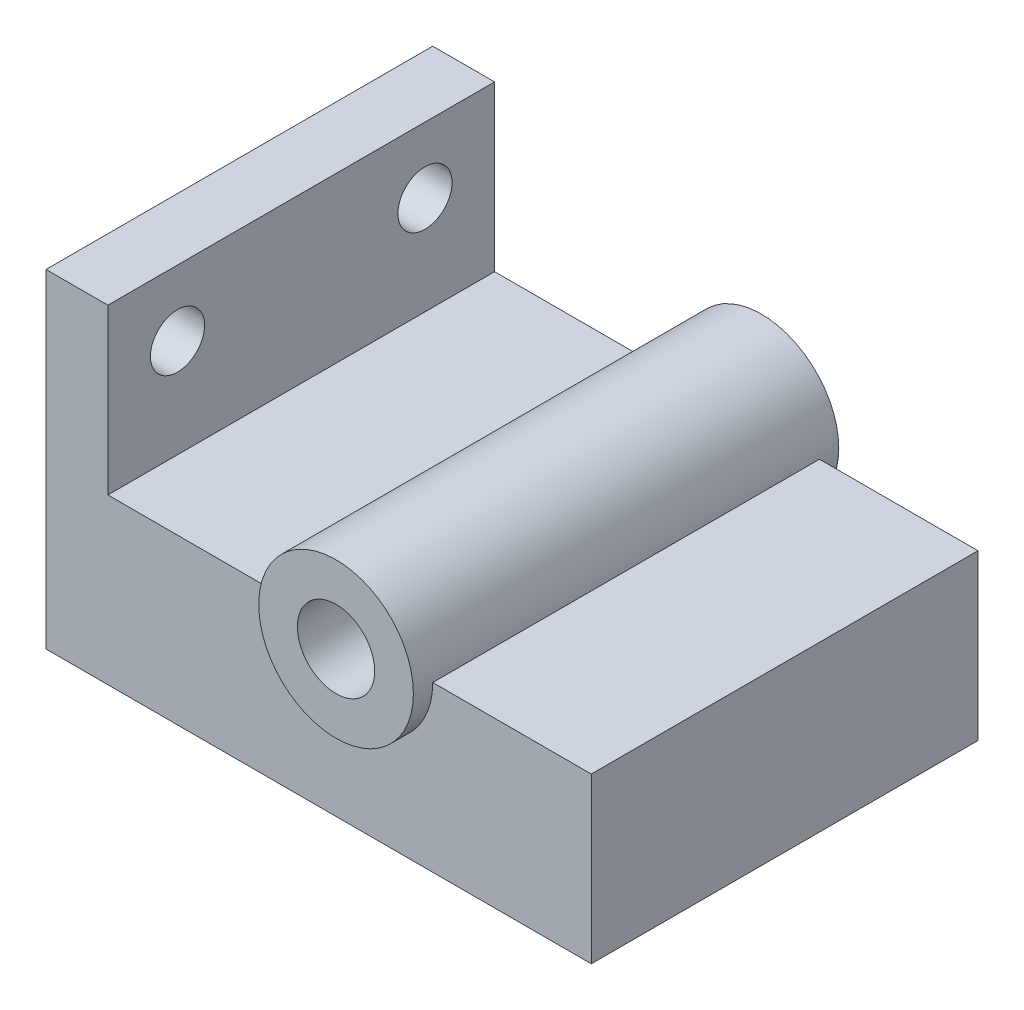
ISO-10303-21;
HEADER;
FILE_DESCRIPTION(('STEP AP214'),'2;1');
FILE_NAME('part.step','',(''),(''),'','','');
FILE_SCHEMA(('AUTOMOTIVE_DESIGN { 1 0 10303 214 1 1 1 1 }'));
ENDSEC;
DATA;
#1=APPLICATION_CONTEXT('core data for automotive mechanical design processes');
#2=APPLICATION_PROTOCOL_DEFINITION('international standard','automotive_design',2000,#1);
#3=PRODUCT_CONTEXT('',#1,'mechanical');
#4=PRODUCT('Part','Part','',(#3));
#5=PRODUCT_RELATED_PRODUCT_CATEGORY('part','',(#4));
#6=PRODUCT_DEFINITION_FORMATION('','',#4);
#7=PRODUCT_DEFINITION_CONTEXT('part definition',#1,'design');
#8=PRODUCT_DEFINITION('design','',#6,#7);
#9=PRODUCT_DEFINITION_SHAPE('','',#8);
#10=(LENGTH_UNIT() NAMED_UNIT(*) SI_UNIT(.MILLI.,.METRE.));
#11=(NAMED_UNIT(*) PLANE_ANGLE_UNIT() SI_UNIT($,.RADIAN.));
#12=(NAMED_UNIT(*) SI_UNIT($,.STERADIAN.) SOLID_ANGLE_UNIT());
#13=UNCERTAINTY_MEASURE_WITH_UNIT(LENGTH_MEASURE(1.E-05),#10,'distance_accuracy_value','');
#14=(GEOMETRIC_REPRESENTATION_CONTEXT(3) GLOBAL_UNCERTAINTY_ASSIGNED_CONTEXT((#13)) GLOBAL_UNIT_ASSIGNED_CONTEXT((#10,
#11,#12)) REPRESENTATION_CONTEXT('',''));
#15=CARTESIAN_POINT('',(0.,0.,0.));
#16=DIRECTION('',(0.,0.,1.));
#17=DIRECTION('',(1.,0.,0.));
#18=AXIS2_PLACEMENT_3D('',#15,#16,#17);
#19=CARTESIAN_POINT('',(1623.00318177857,830.782645564034,-50.0000270000001));
#20=DIRECTION('',(0.,1.,0.));
#21=DIRECTION('',(-1.,0.,0.));
#22=AXIS2_PLACEMENT_3D('',#19,#20,#21);
#23=PLANE('',#22);
#24=DIRECTION('',(0.,0.,1.));
#25=VECTOR('',#24,1.);
#26=CARTESIAN_POINT('',(1723.00323577857,830.782645564034,-50.0000270000001));
#27=LINE('',#26,#25);
#28=CARTESIAN_POINT('',(1723.00323577857,830.782645564034,-50.0000270000001));
#29=VERTEX_POINT('',#28);
#30=CARTESIAN_POINT('',(1723.00323577857,830.782645564034,50.0000269999999));
#31=VERTEX_POINT('',#30);
#32=EDGE_CURVE('E11',#29,#31,#27,.T.);
#33=ORIENTED_EDGE('',*,*,#32,.T.);
#34=DIRECTION('',(-1.,0.,0.));
#35=VECTOR('',#34,1.);
#36=CARTESIAN_POINT('',(1623.00318177857,830.782645564034,50.0000269999999));
#37=LINE('',#36,#35);
#38=CARTESIAN_POINT('',(1764.00325791857,830.782645564034,50.0000269999999));
#39=VERTEX_POINT('',#38);
#40=EDGE_CURVE('E201',#39,#31,#37,.T.);
#41=ORIENTED_EDGE('',*,*,#40,.F.);
#42=DIRECTION('',(0.,0.,1.));
#43=VECTOR('',#42,1.);
#44=CARTESIAN_POINT('',(1764.00325791857,830.782645564034,-50.0000270000001));
#45=LINE('',#44,#43);
#46=CARTESIAN_POINT('',(1764.00325791857,830.782645564034,-50.0000270000001));
#47=VERTEX_POINT('',#46);
#48=EDGE_CURVE('E45',#47,#39,#45,.T.);
#49=ORIENTED_EDGE('',*,*,#48,.F.);
#50=DIRECTION('',(-1.,0.,0.));
#51=VECTOR('',#50,1.);
#52=CARTESIAN_POINT('',(1623.00318177857,830.782645564034,-50.0000270000001));
#53=LINE('',#52,#51);
#54=EDGE_CURVE('E222',#47,#29,#53,.T.);
#55=ORIENTED_EDGE('',*,*,#54,.T.);
#56=EDGE_LOOP('',(#33,#41,#49,#55));
#57=FACE_BOUND('',#56,.T.);
#58=ADVANCED_FACE('F36',(#57),#23,.T.);
#59=CARTESIAN_POINT('',(1764.00325791857,788.282622614034,-50.0000270000001));
#60=DIRECTION('',(1.,0.,0.));
#61=DIRECTION('',(0.,0.,-1.));
#62=AXIS2_PLACEMENT_3D('',#59,#60,#61);
#63=PLANE('',#62);
#64=ORIENTED_EDGE('',*,*,#48,.T.);
#65=DIRECTION('',(0.,1.,0.));
#66=VECTOR('',#65,1.);
#67=CARTESIAN_POINT('',(1764.00325791857,788.282622614034,50.0000269999999));
#68=LINE('',#67,#66);
#69=CARTESIAN_POINT('',(1764.00325791857,788.282622614034,50.0000269999999));
#70=VERTEX_POINT('',#69);
#71=EDGE_CURVE('E198',#70,#39,#68,.T.);
#72=ORIENTED_EDGE('',*,*,#71,.F.);
#73=DIRECTION('',(0.,0.,1.));
#74=VECTOR('',#73,1.);
#75=CARTESIAN_POINT('',(1764.00325791857,788.282622614034,-50.0000270000001));
#76=LINE('',#75,#74);
#77=CARTESIAN_POINT('',(1764.00325791857,788.282622614034,-50.0000270000001));
#78=VERTEX_POINT('',#77);
#79=EDGE_CURVE('E226',#78,#70,#76,.T.);
#80=ORIENTED_EDGE('',*,*,#79,.F.);
#81=DIRECTION('',(0.,1.,0.));
#82=VECTOR('',#81,1.);
#83=CARTESIAN_POINT('',(1764.00325791857,788.282622614034,-50.0000270000001));
#84=LINE('',#83,#82);
#85=EDGE_CURVE('E219',#78,#47,#84,.T.);
#86=ORIENTED_EDGE('',*,*,#85,.T.);
#87=EDGE_LOOP('',(#64,#72,#80,#86));
#88=FACE_BOUND('',#87,.T.);
#89=ADVANCED_FACE('F267',(#88),#63,.T.);
#90=CARTESIAN_POINT('',(1623.00318177857,788.282622614034,-50.0000270000001));
#91=DIRECTION('',(0.,-1.,0.));
#92=DIRECTION('',(0.,0.,-1.));
#93=AXIS2_PLACEMENT_3D('',#90,#91,#92);
#94=PLANE('',#93);
#95=DIRECTION('',(-1.,0.,0.));
#96=VECTOR('',#95,1.);
#97=CARTESIAN_POINT('',(1748.00324927857,788.282622614034,-30.0000162000001));
#98=LINE('',#97,#96);
#99=CARTESIAN_POINT('',(1748.00324927857,788.282622614034,-30.0000162000001));
#100=VERTEX_POINT('',#99);
#101=CARTESIAN_POINT('',(1623.00318177857,788.282622614034,-30.0000162000001));
#102=VERTEX_POINT('',#101);
#103=EDGE_CURVE('E130',#100,#102,#98,.T.);
#104=ORIENTED_EDGE('',*,*,#103,.T.);
#105=DIRECTION('',(0.,0.,1.));
#106=VECTOR('',#105,1.);
#107=CARTESIAN_POINT('',(1623.00318177857,788.282622614034,-50.0000270000001));
#108=LINE('',#107,#106);
#109=CARTESIAN_POINT('',(1623.00318177857,788.282622614034,-50.0000270000001));
#110=VERTEX_POINT('',#109);
#111=EDGE_CURVE('E228',#110,#102,#108,.T.);
#112=ORIENTED_EDGE('',*,*,#111,.F.);
#113=DIRECTION('',(1.,0.,0.));
#114=VECTOR('',#113,1.);
#115=CARTESIAN_POINT('',(1623.00318177857,788.282622614034,-50.0000270000001));
#116=LINE('',#115,#114);
#117=EDGE_CURVE('E216',#110,#78,#116,.T.);
#118=ORIENTED_EDGE('',*,*,#117,.T.);
#119=ORIENTED_EDGE('',*,*,#79,.T.);
#120=DIRECTION('',(1.,0.,0.));
#121=VECTOR('',#120,1.);
#122=CARTESIAN_POINT('',(1623.00318177857,788.282622614034,50.0000269999999));
#123=LINE('',#122,#121);
#124=CARTESIAN_POINT('',(1623.00318177857,788.282622614034,50.0000269999999));
#125=VERTEX_POINT('',#124);
#126=EDGE_CURVE('E195',#125,#70,#123,.T.);
#127=ORIENTED_EDGE('',*,*,#126,.F.);
#128=CARTESIAN_POINT('',(1623.00318177857,788.282622614034,30.0000161999998));
#129=VERTEX_POINT('',#128);
#130=EDGE_CURVE('E230',#129,#125,#108,.T.);
#131=ORIENTED_EDGE('',*,*,#130,.F.);
#132=DIRECTION('',(-1.,0.,0.));
#133=VECTOR('',#132,1.);
#134=CARTESIAN_POINT('',(1748.00324927857,788.282622614034,30.0000161999999));
#135=LINE('',#134,#133);
#136=CARTESIAN_POINT('',(1748.00324927857,788.282622614034,30.0000161999999));
#137=VERTEX_POINT('',#136);
#138=EDGE_CURVE('E53',#137,#129,#135,.T.);
#139=ORIENTED_EDGE('',*,*,#138,.F.);
#140=DIRECTION('',(0.,0.,1.));
#141=VECTOR('',#140,1.);
#142=CARTESIAN_POINT('',(1748.00324927857,788.282622614034,-30.0000162000001));
#143=LINE('',#142,#141);
#144=EDGE_CURVE('E146',#100,#137,#143,.T.);
#145=ORIENTED_EDGE('',*,*,#144,.F.);
#146=EDGE_LOOP('',(#104,#112,#118,#119,#127,#131,#139,#145));
#147=FACE_BOUND('',#146,.T.);
#148=ADVANCED_FACE('F150',(#147),#94,.T.);
#149=CARTESIAN_POINT('',(1623.00318177857,788.282622614034,-50.0000270000001));
#150=DIRECTION('',(-1.,0.,0.));
#151=DIRECTION('',(0.,-1.,0.));
#152=AXIS2_PLACEMENT_3D('',#149,#150,#151);
#153=PLANE('',#152);
#154=CARTESIAN_POINT('',(1623.00318177857,856.282659334034,-32.0000172800001));
#155=DIRECTION('',(-1.,0.,0.));
#156=DIRECTION('',(0.,-1.,0.));
#157=AXIS2_PLACEMENT_3D('',#154,#155,#156);
#158=CIRCLE('',#157,7.00000378);
#159=CARTESIAN_POINT('',(1623.00318177857,849.282655554034,-32.0000172800001));
#160=VERTEX_POINT('',#159);
#161=EDGE_CURVE('E240',#160,#160,#158,.T.);
#162=ORIENTED_EDGE('',*,*,#161,.F.);
#163=EDGE_LOOP('',(#162));
#164=FACE_BOUND('',#163,.T.);
#165=CARTESIAN_POINT('',(1623.00318177857,856.282659334034,32.0000172799999));
#166=DIRECTION('',(-1.,0.,0.));
#167=DIRECTION('',(0.,-1.,0.));
#168=AXIS2_PLACEMENT_3D('',#165,#166,#167);
#169=CIRCLE('',#168,7.00000378);
#170=CARTESIAN_POINT('',(1623.00318177857,849.282655554034,32.0000172799999));
#171=VERTEX_POINT('',#170);
#172=EDGE_CURVE('E245',#171,#171,#169,.T.);
#173=ORIENTED_EDGE('',*,*,#172,.F.);
#174=EDGE_LOOP('',(#173));
#175=FACE_BOUND('',#174,.T.);
#176=DIRECTION('',(0.,-1.,0.));
#177=VECTOR('',#176,1.);
#178=CARTESIAN_POINT('',(1623.00318177857,813.282636114033,-30.0000162000001));
#179=LINE('',#178,#177);
#180=CARTESIAN_POINT('',(1623.00318177857,813.282636114033,-30.0000162000001));
#181=VERTEX_POINT('',#180);
#182=EDGE_CURVE('E136',#181,#102,#179,.T.);
#183=ORIENTED_EDGE('',*,*,#182,.F.);
#184=DIRECTION('',(0.,0.,-1.));
#185=VECTOR('',#184,1.);
#186=CARTESIAN_POINT('',(1623.00318177857,813.282636114033,-30.0000162000001));
#187=LINE('',#186,#185);
#188=CARTESIAN_POINT('',(1623.00318177857,813.282636114034,30.0000161999999));
#189=VERTEX_POINT('',#188);
#190=EDGE_CURVE('E148',#189,#181,#187,.T.);
#191=ORIENTED_EDGE('',*,*,#190,.F.);
#192=DIRECTION('',(0.,1.,0.));
#193=VECTOR('',#192,1.);
#194=CARTESIAN_POINT('',(1623.00318177857,813.282636114034,30.0000161999999));
#195=LINE('',#194,#193);
#196=EDGE_CURVE('E159',#129,#189,#195,.T.);
#197=ORIENTED_EDGE('',*,*,#196,.F.);
#198=ORIENTED_EDGE('',*,*,#130,.T.);
#199=DIRECTION('',(0.,-1.,0.));
#200=VECTOR('',#199,1.);
#201=CARTESIAN_POINT('',(1623.00318177857,788.282622614034,50.0000269999999));
#202=LINE('',#201,#200);
#203=CARTESIAN_POINT('',(1623.00318177857,873.282668514034,50.0000269999999));
#204=VERTEX_POINT('',#203);
#205=EDGE_CURVE('E192',#204,#125,#202,.T.);
#206=ORIENTED_EDGE('',*,*,#205,.F.);
#207=DIRECTION('',(0.,0.,1.));
#208=VECTOR('',#207,1.);
#209=CARTESIAN_POINT('',(1623.00318177857,873.282668514034,-50.0000270000001));
#210=LINE('',#209,#208);
#211=CARTESIAN_POINT('',(1623.00318177857,873.282668514034,-50.0000270000001));
#212=VERTEX_POINT('',#211);
#213=EDGE_CURVE('E231',#212,#204,#210,.T.);
#214=ORIENTED_EDGE('',*,*,#213,.F.);
#215=DIRECTION('',(0.,-1.,0.));
#216=VECTOR('',#215,1.);
#217=CARTESIAN_POINT('',(1623.00318177857,788.282622614034,-50.0000270000001));
#218=LINE('',#217,#216);
#219=EDGE_CURVE('E213',#212,#110,#218,.T.);
#220=ORIENTED_EDGE('',*,*,#219,.T.);
#221=ORIENTED_EDGE('',*,*,#111,.T.);
#222=EDGE_LOOP('',(#183,#191,#197,#198,#206,#214,#220,#221));
#223=FACE_BOUND('',#222,.T.);
#224=ADVANCED_FACE('F254',(#164,#175,#223),#153,.T.);
#225=CARTESIAN_POINT('',(1623.00318177857,873.282668514034,-50.0000270000001));
#226=DIRECTION('',(0.,1.,0.));
#227=DIRECTION('',(0.,0.,1.));
#228=AXIS2_PLACEMENT_3D('',#225,#226,#227);
#229=PLANE('',#228);
#230=ORIENTED_EDGE('',*,*,#213,.T.);
#231=DIRECTION('',(-1.,0.,0.));
#232=VECTOR('',#231,1.);
#233=CARTESIAN_POINT('',(1623.00318177857,873.282668514034,50.0000269999999));
#234=LINE('',#233,#232);
#235=CARTESIAN_POINT('',(1639.00319041857,873.282668514034,50.0000269999999));
#236=VERTEX_POINT('',#235);
#237=EDGE_CURVE('E189',#236,#204,#234,.T.);
#238=ORIENTED_EDGE('',*,*,#237,.F.);
#239=DIRECTION('',(0.,0.,1.));
#240=VECTOR('',#239,1.);
#241=CARTESIAN_POINT('',(1639.00319041857,873.282668514034,-50.0000270000001));
#242=LINE('',#241,#240);
#243=CARTESIAN_POINT('',(1639.00319041857,873.282668514034,-50.0000270000001));
#244=VERTEX_POINT('',#243);
#245=EDGE_CURVE('E233',#244,#236,#242,.T.);
#246=ORIENTED_EDGE('',*,*,#245,.F.);
#247=DIRECTION('',(-1.,0.,0.));
#248=VECTOR('',#247,1.);
#249=CARTESIAN_POINT('',(1623.00318177857,873.282668514034,-50.0000270000001));
#250=LINE('',#249,#248);
#251=EDGE_CURVE('E210',#244,#212,#250,.T.);
#252=ORIENTED_EDGE('',*,*,#251,.T.);
#253=EDGE_LOOP('',(#230,#238,#246,#252));
#254=FACE_BOUND('',#253,.T.);
#255=ADVANCED_FACE('F257',(#254),#229,.T.);
#256=CARTESIAN_POINT('',(1639.00319041857,788.282622614034,-50.0000270000001));
#257=DIRECTION('',(1.,0.,0.));
#258=DIRECTION('',(0.,1.,0.));
#259=AXIS2_PLACEMENT_3D('',#256,#257,#258);
#260=PLANE('',#259);
#261=CARTESIAN_POINT('',(1639.00319041857,856.282659334034,-32.0000172800001));
#262=DIRECTION('',(1.,0.,0.));
#263=DIRECTION('',(0.,1.,0.));
#264=AXIS2_PLACEMENT_3D('',#261,#262,#263);
#265=CIRCLE('',#264,7.00000378);
#266=CARTESIAN_POINT('',(1639.00319041857,863.282663114034,-32.0000172800001));
#267=VERTEX_POINT('',#266);
#268=EDGE_CURVE('E40',#267,#267,#265,.T.);
#269=ORIENTED_EDGE('',*,*,#268,.F.);
#270=EDGE_LOOP('',(#269));
#271=FACE_BOUND('',#270,.T.);
#272=CARTESIAN_POINT('',(1639.00319041857,856.282659334034,32.0000172799999));
#273=DIRECTION('',(1.,0.,0.));
#274=DIRECTION('',(0.,1.,0.));
#275=AXIS2_PLACEMENT_3D('',#272,#273,#274);
#276=CIRCLE('',#275,7.00000378);
#277=CARTESIAN_POINT('',(1639.00319041857,863.282663114034,32.0000172799999));
#278=VERTEX_POINT('',#277);
#279=EDGE_CURVE('E238',#278,#278,#276,.T.);
#280=ORIENTED_EDGE('',*,*,#279,.F.);
#281=EDGE_LOOP('',(#280));
#282=FACE_BOUND('',#281,.T.);
#283=ORIENTED_EDGE('',*,*,#245,.T.);
#284=DIRECTION('',(0.,1.,0.));
#285=VECTOR('',#284,1.);
#286=CARTESIAN_POINT('',(1639.00319041857,788.282622614034,50.0000269999999));
#287=LINE('',#286,#285);
#288=CARTESIAN_POINT('',(1639.00319041857,830.782645564034,50.0000269999999));
#289=VERTEX_POINT('',#288);
#290=EDGE_CURVE('E186',#289,#236,#287,.T.);
#291=ORIENTED_EDGE('',*,*,#290,.F.);
#292=DIRECTION('',(0.,0.,1.));
#293=VECTOR('',#292,1.);
#294=CARTESIAN_POINT('',(1639.00319041857,830.782645564034,-50.0000270000001));
#295=LINE('',#294,#293);
#296=CARTESIAN_POINT('',(1639.00319041857,830.782645564034,-50.0000270000001));
#297=VERTEX_POINT('',#296);
#298=EDGE_CURVE('E235',#297,#289,#295,.T.);
#299=ORIENTED_EDGE('',*,*,#298,.F.);
#300=DIRECTION('',(0.,1.,0.));
#301=VECTOR('',#300,1.);
#302=CARTESIAN_POINT('',(1639.00319041857,788.282622614034,-50.0000270000001));
#303=LINE('',#302,#301);
#304=EDGE_CURVE('E207',#297,#244,#303,.T.);
#305=ORIENTED_EDGE('',*,*,#304,.T.);
#306=EDGE_LOOP('',(#283,#291,#299,#305));
#307=FACE_BOUND('',#306,.T.);
#308=ADVANCED_FACE('F302',(#271,#282,#307),#260,.T.);
#309=CARTESIAN_POINT('',(1623.00318177857,830.782645564034,-50.0000270000001));
#310=DIRECTION('',(0.,1.,0.));
#311=DIRECTION('',(-1.,0.,0.));
#312=AXIS2_PLACEMENT_3D('',#309,#310,#311);
#313=PLANE('',#312);
#314=ORIENTED_EDGE('',*,*,#298,.T.);
#315=DIRECTION('',(-1.,0.,0.));
#316=VECTOR('',#315,1.);
#317=CARTESIAN_POINT('',(1623.00318177857,830.782645564034,50.0000269999999));
#318=LINE('',#317,#316);
#319=CARTESIAN_POINT('',(1683.00321417857,830.782645564034,50.0000269999999));
#320=VERTEX_POINT('',#319);
#321=EDGE_CURVE('E183',#320,#289,#318,.T.);
#322=ORIENTED_EDGE('',*,*,#321,.F.);
#323=DIRECTION('',(0.,0.,1.));
#324=VECTOR('',#323,1.);
#325=CARTESIAN_POINT('',(1683.00321417857,830.782645564034,-50.0000270000001));
#326=LINE('',#325,#324);
#327=CARTESIAN_POINT('',(1683.00321417857,830.782645564034,-50.0000270000001));
#328=VERTEX_POINT('',#327);
#329=EDGE_CURVE('E223',#328,#320,#326,.T.);
#330=ORIENTED_EDGE('',*,*,#329,.F.);
#331=DIRECTION('',(-1.,0.,0.));
#332=VECTOR('',#331,1.);
#333=CARTESIAN_POINT('',(1623.00318177857,830.782645564034,-50.0000270000001));
#334=LINE('',#333,#332);
#335=EDGE_CURVE('E204',#328,#297,#334,.T.);
#336=ORIENTED_EDGE('',*,*,#335,.T.);
#337=EDGE_LOOP('',(#314,#322,#330,#336));
#338=FACE_BOUND('',#337,.T.);
#339=ADVANCED_FACE('F38',(#338),#313,.T.);
#340=CARTESIAN_POINT('',(1623.00318177857,788.282622614034,-50.0000270000001));
#341=DIRECTION('',(0.,0.,1.));
#342=DIRECTION('',(1.,0.,0.));
#343=AXIS2_PLACEMENT_3D('',#340,#341,#342);
#344=PLANE('',#343);
#345=CARTESIAN_POINT('',(1703.00322497857,830.782645564034,-50.0000270000001));
#346=DIRECTION('',(0.,0.,1.));
#347=DIRECTION('',(1.,0.,0.));
#348=AXIS2_PLACEMENT_3D('',#345,#346,#347);
#349=CIRCLE('',#348,20.0000108);
#350=EDGE_CURVE('E61',#328,#29,#349,.T.);
#351=ORIENTED_EDGE('',*,*,#350,.T.);
#352=ORIENTED_EDGE('',*,*,#54,.F.);
#353=ORIENTED_EDGE('',*,*,#85,.F.);
#354=ORIENTED_EDGE('',*,*,#117,.F.);
#355=ORIENTED_EDGE('',*,*,#219,.F.);
#356=ORIENTED_EDGE('',*,*,#251,.F.);
#357=ORIENTED_EDGE('',*,*,#304,.F.);
#358=ORIENTED_EDGE('',*,*,#335,.F.);
#359=EDGE_LOOP('',(#351,#352,#353,#354,#355,#356,#357,#358));
#360=FACE_BOUND('',#359,.T.);
#361=ADVANCED_FACE('F264',(#360),#344,.F.);
#362=CARTESIAN_POINT('',(1623.00318177857,788.282622614034,50.0000269999999));
#363=DIRECTION('',(0.,0.,1.));
#364=DIRECTION('',(1.,0.,0.));
#365=AXIS2_PLACEMENT_3D('',#362,#363,#364);
#366=PLANE('',#365);
#367=CARTESIAN_POINT('',(1703.00322497857,830.782645564034,50.0000269999999));
#368=DIRECTION('',(0.,0.,1.));
#369=DIRECTION('',(1.,0.,0.));
#370=AXIS2_PLACEMENT_3D('',#367,#368,#369);
#371=CIRCLE('',#370,20.0000108);
#372=EDGE_CURVE('E180',#320,#31,#371,.T.);
#373=ORIENTED_EDGE('',*,*,#372,.F.);
#374=ORIENTED_EDGE('',*,*,#321,.T.);
#375=ORIENTED_EDGE('',*,*,#290,.T.);
#376=ORIENTED_EDGE('',*,*,#237,.T.);
#377=ORIENTED_EDGE('',*,*,#205,.T.);
#378=ORIENTED_EDGE('',*,*,#126,.T.);
#379=ORIENTED_EDGE('',*,*,#71,.T.);
#380=ORIENTED_EDGE('',*,*,#40,.T.);
#381=EDGE_LOOP('',(#373,#374,#375,#376,#377,#378,#379,#380));
#382=FACE_BOUND('',#381,.T.);
#383=ADVANCED_FACE('F272',(#382),#366,.T.);
#384=CARTESIAN_POINT('',(1703.00322497857,830.782645564034,-55.0000297000001));
#385=DIRECTION('',(0.,0.,1.));
#386=DIRECTION('',(1.,0.,0.));
#387=AXIS2_PLACEMENT_3D('',#384,#385,#386);
#388=CYLINDRICAL_SURFACE('',#387,20.0000108);
#389=CARTESIAN_POINT('',(1703.00322497857,830.782645564034,55.0000296999999));
#390=DIRECTION('',(0.,0.,1.));
#391=DIRECTION('',(1.,0.,0.));
#392=AXIS2_PLACEMENT_3D('',#389,#390,#391);
#393=CIRCLE('',#392,20.0000108);
#394=CARTESIAN_POINT('',(1723.00323577857,830.782645564034,55.0000296999999));
#395=VERTEX_POINT('',#394);
#396=EDGE_CURVE('E171',#395,#395,#393,.T.);
#397=ORIENTED_EDGE('',*,*,#396,.F.);
#398=EDGE_LOOP('',(#397));
#399=FACE_BOUND('',#398,.T.);
#400=CARTESIAN_POINT('',(1703.00322497857,830.782645564034,-55.0000297000001));
#401=DIRECTION('',(0.,0.,1.));
#402=DIRECTION('',(1.,0.,0.));
#403=AXIS2_PLACEMENT_3D('',#400,#401,#402);
#404=CIRCLE('',#403,20.0000108);
#405=CARTESIAN_POINT('',(1723.00323577857,830.782645564034,-55.0000297000001));
#406=VERTEX_POINT('',#405);
#407=EDGE_CURVE('E177',#406,#406,#404,.T.);
#408=ORIENTED_EDGE('',*,*,#407,.T.);
#409=EDGE_LOOP('',(#408));
#410=FACE_BOUND('',#409,.T.);
#411=ORIENTED_EDGE('',*,*,#350,.F.);
#412=ORIENTED_EDGE('',*,*,#329,.T.);
#413=ORIENTED_EDGE('',*,*,#372,.T.);
#414=ORIENTED_EDGE('',*,*,#32,.F.);
#415=EDGE_LOOP('',(#411,#412,#413,#414));
#416=FACE_BOUND('',#415,.T.);
#417=ADVANCED_FACE('F316',(#399,#410,#416),#388,.T.);
#418=CARTESIAN_POINT('',(1703.00322497857,830.782645564034,-55.0000297000001));
#419=DIRECTION('',(0.,0.,1.));
#420=DIRECTION('',(1.,0.,0.));
#421=AXIS2_PLACEMENT_3D('',#418,#419,#420);
#422=CYLINDRICAL_SURFACE('',#421,10.0000054);
#423=CARTESIAN_POINT('',(1703.00322497857,830.782645564034,-55.0000297000001));
#424=DIRECTION('',(0.,0.,1.));
#425=DIRECTION('',(1.,0.,0.));
#426=AXIS2_PLACEMENT_3D('',#423,#424,#425);
#427=CIRCLE('',#426,10.0000054);
#428=CARTESIAN_POINT('',(1713.00323037857,830.782645564034,-55.0000297000001));
#429=VERTEX_POINT('',#428);
#430=EDGE_CURVE('E174',#429,#429,#427,.T.);
#431=ORIENTED_EDGE('',*,*,#430,.F.);
#432=EDGE_LOOP('',(#431));
#433=FACE_BOUND('',#432,.T.);
#434=CARTESIAN_POINT('',(1703.00322497857,830.782645564034,55.0000296999999));
#435=DIRECTION('',(0.,0.,1.));
#436=DIRECTION('',(1.,0.,0.));
#437=AXIS2_PLACEMENT_3D('',#434,#435,#436);
#438=CIRCLE('',#437,10.0000054);
#439=CARTESIAN_POINT('',(1713.00323037857,830.782645564034,55.0000296999999));
#440=VERTEX_POINT('',#439);
#441=EDGE_CURVE('E165',#440,#440,#438,.T.);
#442=ORIENTED_EDGE('',*,*,#441,.T.);
#443=EDGE_LOOP('',(#442));
#444=FACE_BOUND('',#443,.T.);
#445=ADVANCED_FACE('F319',(#433,#444),#422,.F.);
#446=CARTESIAN_POINT('',(1623.00318177857,788.282622614034,-55.0000297000001));
#447=DIRECTION('',(0.,0.,1.));
#448=DIRECTION('',(1.,0.,0.));
#449=AXIS2_PLACEMENT_3D('',#446,#447,#448);
#450=PLANE('',#449);
#451=ORIENTED_EDGE('',*,*,#430,.T.);
#452=EDGE_LOOP('',(#451));
#453=FACE_BOUND('',#452,.T.);
#454=ORIENTED_EDGE('',*,*,#407,.F.);
#455=EDGE_LOOP('',(#454));
#456=FACE_BOUND('',#455,.T.);
#457=ADVANCED_FACE('F326',(#453,#456),#450,.F.);
#458=CARTESIAN_POINT('',(1623.00318177857,788.282622614034,55.0000296999999));
#459=DIRECTION('',(0.,0.,1.));
#460=DIRECTION('',(1.,0.,0.));
#461=AXIS2_PLACEMENT_3D('',#458,#459,#460);
#462=PLANE('',#461);
#463=ORIENTED_EDGE('',*,*,#441,.F.);
#464=EDGE_LOOP('',(#463));
#465=FACE_BOUND('',#464,.T.);
#466=ORIENTED_EDGE('',*,*,#396,.T.);
#467=EDGE_LOOP('',(#466));
#468=FACE_BOUND('',#467,.T.);
#469=ADVANCED_FACE('F286',(#465,#468),#462,.T.);
#470=CARTESIAN_POINT('',(1748.00324927857,813.282636114033,-30.0000162000001));
#471=DIRECTION('',(0.,0.,-1.));
#472=DIRECTION('',(0.,1.,0.));
#473=AXIS2_PLACEMENT_3D('',#470,#471,#472);
#474=PLANE('',#473);
#475=ORIENTED_EDGE('',*,*,#182,.T.);
#476=ORIENTED_EDGE('',*,*,#103,.F.);
#477=DIRECTION('',(0.,-1.,0.));
#478=VECTOR('',#477,1.);
#479=CARTESIAN_POINT('',(1748.00324927857,813.282636114033,-30.0000162000001));
#480=LINE('',#479,#478);
#481=CARTESIAN_POINT('',(1748.00324927857,813.282636114033,-30.0000162000001));
#482=VERTEX_POINT('',#481);
#483=EDGE_CURVE('E133',#482,#100,#480,.T.);
#484=ORIENTED_EDGE('',*,*,#483,.F.);
#485=DIRECTION('',(-1.,0.,0.));
#486=VECTOR('',#485,1.);
#487=CARTESIAN_POINT('',(1748.00324927857,813.282636114033,-30.0000162000001));
#488=LINE('',#487,#486);
#489=EDGE_CURVE('E163',#482,#181,#488,.T.);
#490=ORIENTED_EDGE('',*,*,#489,.T.);
#491=EDGE_LOOP('',(#475,#476,#484,#490));
#492=FACE_BOUND('',#491,.T.);
#493=ADVANCED_FACE('F132',(#492),#474,.F.);
#494=CARTESIAN_POINT('',(1748.00324927857,813.282636114033,-30.0000162000001));
#495=DIRECTION('',(0.,1.,0.));
#496=DIRECTION('',(0.,0.,1.));
#497=AXIS2_PLACEMENT_3D('',#494,#495,#496);
#498=PLANE('',#497);
#499=ORIENTED_EDGE('',*,*,#190,.T.);
#500=ORIENTED_EDGE('',*,*,#489,.F.);
#501=DIRECTION('',(0.,0.,-1.));
#502=VECTOR('',#501,1.);
#503=CARTESIAN_POINT('',(1748.00324927857,813.282636114033,-30.0000162000001));
#504=LINE('',#503,#502);
#505=CARTESIAN_POINT('',(1748.00324927857,813.282636114034,30.0000161999999));
#506=VERTEX_POINT('',#505);
#507=EDGE_CURVE('E140',#506,#482,#504,.T.);
#508=ORIENTED_EDGE('',*,*,#507,.F.);
#509=DIRECTION('',(-1.,0.,0.));
#510=VECTOR('',#509,1.);
#511=CARTESIAN_POINT('',(1748.00324927857,813.282636114034,30.0000161999999));
#512=LINE('',#511,#510);
#513=EDGE_CURVE('E166',#506,#189,#512,.T.);
#514=ORIENTED_EDGE('',*,*,#513,.T.);
#515=EDGE_LOOP('',(#499,#500,#508,#514));
#516=FACE_BOUND('',#515,.T.);
#517=ADVANCED_FACE('F278',(#516),#498,.F.);
#518=CARTESIAN_POINT('',(1748.00324927857,813.282636114034,30.0000161999999));
#519=DIRECTION('',(0.,0.,1.));
#520=DIRECTION('',(0.,-1.,0.));
#521=AXIS2_PLACEMENT_3D('',#518,#519,#520);
#522=PLANE('',#521);
#523=ORIENTED_EDGE('',*,*,#196,.T.);
#524=ORIENTED_EDGE('',*,*,#513,.F.);
#525=DIRECTION('',(0.,1.,0.));
#526=VECTOR('',#525,1.);
#527=CARTESIAN_POINT('',(1748.00324927857,813.282636114034,30.0000161999999));
#528=LINE('',#527,#526);
#529=EDGE_CURVE('E152',#137,#506,#528,.T.);
#530=ORIENTED_EDGE('',*,*,#529,.F.);
#531=ORIENTED_EDGE('',*,*,#138,.T.);
#532=EDGE_LOOP('',(#523,#524,#530,#531));
#533=FACE_BOUND('',#532,.T.);
#534=ADVANCED_FACE('F276',(#533),#522,.F.);
#535=CARTESIAN_POINT('',(1748.00324927857,788.282622614034,-1.34099366714252E-13));
#536=DIRECTION('',(-1.,0.,0.));
#537=DIRECTION('',(0.,-1.,0.));
#538=AXIS2_PLACEMENT_3D('',#535,#536,#537);
#539=PLANE('',#538);
#540=ORIENTED_EDGE('',*,*,#483,.T.);
#541=ORIENTED_EDGE('',*,*,#144,.T.);
#542=ORIENTED_EDGE('',*,*,#529,.T.);
#543=ORIENTED_EDGE('',*,*,#507,.T.);
#544=EDGE_LOOP('',(#540,#541,#542,#543));
#545=FACE_BOUND('',#544,.T.);
#546=ADVANCED_FACE('F144',(#545),#539,.T.);
#547=CARTESIAN_POINT('',(1643.00319257857,856.282659334034,32.0000172799999));
#548=DIRECTION('',(-1.,0.,0.));
#549=DIRECTION('',(0.,-1.,0.));
#550=AXIS2_PLACEMENT_3D('',#547,#548,#549);
#551=CYLINDRICAL_SURFACE('',#550,7.00000378);
#552=ORIENTED_EDGE('',*,*,#279,.T.);
#553=EDGE_LOOP('',(#552));
#554=FACE_BOUND('',#553,.T.);
#555=ORIENTED_EDGE('',*,*,#172,.T.);
#556=EDGE_LOOP('',(#555));
#557=FACE_BOUND('',#556,.T.);
#558=ADVANCED_FACE('F252',(#554,#557),#551,.F.);
#559=CARTESIAN_POINT('',(1643.00319257857,856.282659334034,-32.0000172800001));
#560=DIRECTION('',(-1.,0.,0.));
#561=DIRECTION('',(0.,-1.,0.));
#562=AXIS2_PLACEMENT_3D('',#559,#560,#561);
#563=CYLINDRICAL_SURFACE('',#562,7.00000378);
#564=ORIENTED_EDGE('',*,*,#268,.T.);
#565=EDGE_LOOP('',(#564));
#566=FACE_BOUND('',#565,.T.);
#567=ORIENTED_EDGE('',*,*,#161,.T.);
#568=EDGE_LOOP('',(#567));
#569=FACE_BOUND('',#568,.T.);
#570=ADVANCED_FACE('F374',(#566,#569),#563,.F.);
#571=CLOSED_SHELL('',(#58,#89,#148,#224,#255,#308,#339,#361,#383,#417,#445,#457,#469,#493,#517,
#534,#546,#558,#570));
#572=MANIFOLD_SOLID_BREP('B2',#571);
#573=ADVANCED_BREP_SHAPE_REPRESENTATION('',(#18,#572),#14);
#574=SHAPE_DEFINITION_REPRESENTATION(#9,#573);
ENDSEC;
END-ISO-10303-21;
